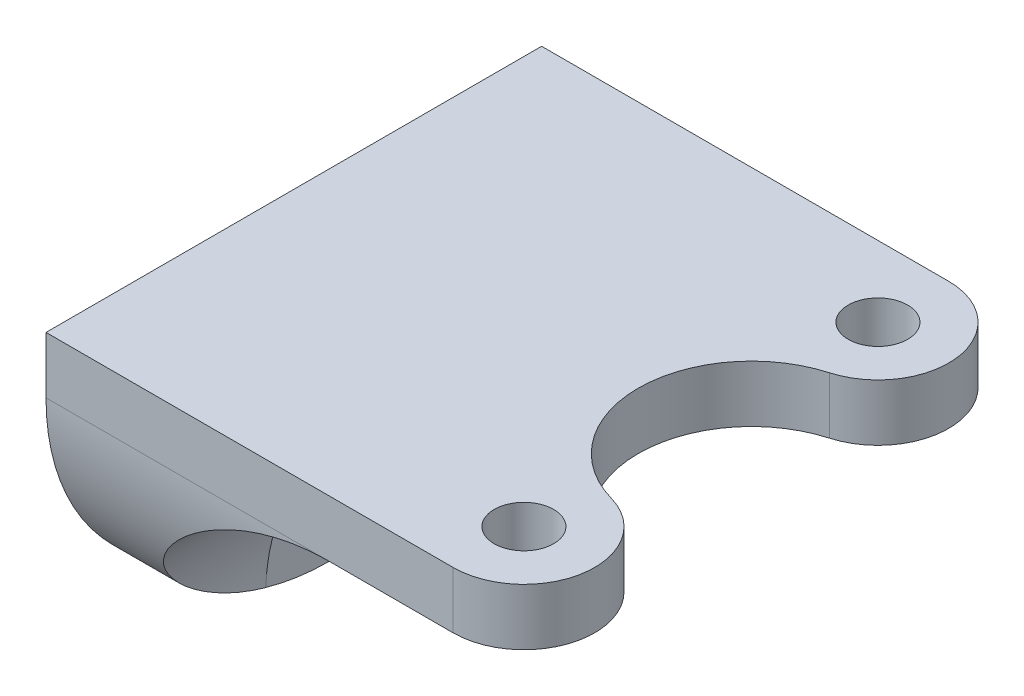
ISO-10303-21;
HEADER;
FILE_DESCRIPTION(('STEP AP214'),'2;1');
FILE_NAME('part.step','',(''),(''),'','','');
FILE_SCHEMA(('AUTOMOTIVE_DESIGN { 1 0 10303 214 1 1 1 1 }'));
ENDSEC;
DATA;
#1=APPLICATION_CONTEXT('core data for automotive mechanical design processes');
#2=APPLICATION_PROTOCOL_DEFINITION('international standard','automotive_design',2000,#1);
#3=PRODUCT_CONTEXT('',#1,'mechanical');
#4=PRODUCT('Part','Part','',(#3));
#5=PRODUCT_RELATED_PRODUCT_CATEGORY('part','',(#4));
#6=PRODUCT_DEFINITION_FORMATION('','',#4);
#7=PRODUCT_DEFINITION_CONTEXT('part definition',#1,'design');
#8=PRODUCT_DEFINITION('design','',#6,#7);
#9=PRODUCT_DEFINITION_SHAPE('','',#8);
#10=(LENGTH_UNIT() NAMED_UNIT(*) SI_UNIT(.MILLI.,.METRE.));
#11=(NAMED_UNIT(*) PLANE_ANGLE_UNIT() SI_UNIT($,.RADIAN.));
#12=(NAMED_UNIT(*) SI_UNIT($,.STERADIAN.) SOLID_ANGLE_UNIT());
#13=UNCERTAINTY_MEASURE_WITH_UNIT(LENGTH_MEASURE(1.E-05),#10,'distance_accuracy_value','');
#14=(GEOMETRIC_REPRESENTATION_CONTEXT(3) GLOBAL_UNCERTAINTY_ASSIGNED_CONTEXT((#13)) GLOBAL_UNIT_ASSIGNED_CONTEXT((#10,
#11,#12)) REPRESENTATION_CONTEXT('',''));
#15=CARTESIAN_POINT('',(0.,0.,0.));
#16=DIRECTION('',(0.,0.,1.));
#17=DIRECTION('',(1.,0.,0.));
#18=AXIS2_PLACEMENT_3D('',#15,#16,#17);
#19=CARTESIAN_POINT('',(4.,-10.,0.));
#20=DIRECTION('',(-1.,0.,0.));
#21=DIRECTION('',(0.,0.,1.));
#22=AXIS2_PLACEMENT_3D('',#19,#20,#21);
#23=CYLINDRICAL_SURFACE('',#22,2.6);
#24=CARTESIAN_POINT('',(0.,-10.,0.));
#25=DIRECTION('',(1.,0.,0.));
#26=DIRECTION('',(0.,0.,-1.));
#27=AXIS2_PLACEMENT_3D('',#24,#25,#26);
#28=CIRCLE('',#27,2.6);
#29=CARTESIAN_POINT('',(0.,-10.,-2.6));
#30=VERTEX_POINT('',#29);
#31=EDGE_CURVE('E344',#30,#30,#28,.T.);
#32=ORIENTED_EDGE('',*,*,#31,.F.);
#33=EDGE_LOOP('',(#32));
#34=FACE_BOUND('',#33,.T.);
#35=CARTESIAN_POINT('',(4.,-10.,0.));
#36=DIRECTION('',(1.,0.,0.));
#37=DIRECTION('',(0.,0.,-1.));
#38=AXIS2_PLACEMENT_3D('',#35,#36,#37);
#39=CIRCLE('',#38,2.6);
#40=CARTESIAN_POINT('',(4.,-10.,-2.6));
#41=VERTEX_POINT('',#40);
#42=EDGE_CURVE('E347',#41,#41,#39,.T.);
#43=ORIENTED_EDGE('',*,*,#42,.T.);
#44=EDGE_LOOP('',(#43));
#45=FACE_BOUND('',#44,.T.);
#46=ADVANCED_FACE('F43',(#34,#45),#23,.F.);
#47=CARTESIAN_POINT('',(4.,-4.,1.50000000000004));
#48=DIRECTION('',(-1.,0.,0.));
#49=DIRECTION('',(0.,0.,1.));
#50=AXIS2_PLACEMENT_3D('',#47,#48,#49);
#51=CYLINDRICAL_SURFACE('',#50,16.);
#52=CARTESIAN_POINT('',(4.,-4.,1.50000000000004));
#53=DIRECTION('',(1.,0.,0.));
#54=DIRECTION('',(0.,0.,-1.));
#55=AXIS2_PLACEMENT_3D('',#52,#53,#54);
#56=CIRCLE('',#55,16.);
#57=CARTESIAN_POINT('',(4.,-19.3541525327841,6.));
#58=VERTEX_POINT('',#57);
#59=CARTESIAN_POINT('',(4.,-20.,1.50000000000004));
#60=VERTEX_POINT('',#59);
#61=EDGE_CURVE('E357',#58,#60,#56,.T.);
#62=ORIENTED_EDGE('',*,*,#61,.F.);
#63=DIRECTION('',(-1.,0.,0.));
#64=VECTOR('',#63,1.);
#65=CARTESIAN_POINT('',(33.75,-19.3541525327841,6.));
#66=LINE('',#65,#64);
#67=CARTESIAN_POINT('',(4.01304028124513,-19.3541525327841,6.));
#68=VERTEX_POINT('',#67);
#69=EDGE_CURVE('E351',#68,#58,#66,.T.);
#70=ORIENTED_EDGE('',*,*,#69,.F.);
#71=CARTESIAN_POINT('',(4.,-20.,1.50000000000004));
#72=CARTESIAN_POINT('',(4.00000851923164,-20.0000024487613,1.72270361274778));
#73=CARTESIAN_POINT('',(4.00000021424389,-19.9953502392111,1.9454045044037));
#74=CARTESIAN_POINT('',(4.00001194280186,-19.9767562481734,2.39041238437752));
#75=CARTESIAN_POINT('',(4.00003197561349,-19.9628147073318,2.61271938274988));
#76=CARTESIAN_POINT('',(4.00016236043493,-19.9256618893986,3.05656148291711));
#77=CARTESIAN_POINT('',(4.00027271199306,-19.9024506586658,3.2780965885667));
#78=CARTESIAN_POINT('',(4.00070968081685,-19.846806097991,3.71998987887598));
#79=CARTESIAN_POINT('',(4.00103630326584,-19.8143725470303,3.94034803520037));
#80=CARTESIAN_POINT('',(4.00257694290808,-19.7031712105544,4.59988653567085));
#81=CARTESIAN_POINT('',(4.00435244505339,-19.6105596925057,5.03685060527537));
#82=CARTESIAN_POINT('',(4.0095502747178,-19.4445639173252,5.68512531663313));
#83=CARTESIAN_POINT('',(4.01170542947892,-19.3847164334122,5.90002878390668));
#84=CARTESIAN_POINT('',(4.01717387958267,-19.2560772646724,6.32720056997185));
#85=CARTESIAN_POINT('',(4.02048750281575,-19.187283051048,6.53946812506807));
#86=CARTESIAN_POINT('',(4.03266877706484,-18.9675437637232,7.17203428782388));
#87=CARTESIAN_POINT('',(4.04377516462871,-18.8033279599834,7.58776099275339));
#88=CARTESIAN_POINT('',(4.07511195087486,-18.4408343617475,8.40373507604534));
#89=CARTESIAN_POINT('',(4.09534177940887,-18.2425586962228,8.80398341999528));
#90=CARTESIAN_POINT('',(4.13527809373697,-17.9210051656234,9.39020316040592));
#91=CARTESIAN_POINT('',(4.15018520829917,-17.8098197486931,9.58321710139696));
#92=CARTESIAN_POINT('',(4.18369331308156,-17.5796758863064,9.96415516302514));
#93=CARTESIAN_POINT('',(4.20229338131313,-17.4607193859549,10.1520805408));
#94=CARTESIAN_POINT('',(4.26440958285752,-17.0925676715534,10.7077096266688));
#95=CARTESIAN_POINT('',(4.31424638765456,-16.8320492629194,11.0673409173672));
#96=CARTESIAN_POINT('',(4.43262988497217,-16.2946415255452,11.7480495666715));
#97=CARTESIAN_POINT('',(4.50037321714628,-16.0187834590487,12.0700825374318));
#98=CARTESIAN_POINT('',(4.65904244851858,-15.4455057952533,12.6882981420798));
#99=CARTESIAN_POINT('',(4.74996781671542,-15.1480866919373,12.9844813678661));
#100=CARTESIAN_POINT('',(4.95826521088042,-14.5364465732705,13.5480709233121));
#101=CARTESIAN_POINT('',(5.0756035273918,-14.2222473599629,13.8155132962289));
#102=CARTESIAN_POINT('',(5.33955662425,-13.5819643810614,14.3199834634258));
#103=CARTESIAN_POINT('',(5.48616630930786,-13.2558826919235,14.5570165392962));
#104=CARTESIAN_POINT('',(5.78837737013365,-12.6426762200264,14.9692811552128));
#105=CARTESIAN_POINT('',(5.94003172342225,-12.3562971974617,15.1485328443778));
#106=CARTESIAN_POINT('',(6.26707211279426,-11.7832197442357,15.4832603095025));
#107=CARTESIAN_POINT('',(6.44245573599521,-11.4965213489854,15.6387384994226));
#108=CARTESIAN_POINT('',(6.81687362104425,-10.9268881521257,15.926367108075));
#109=CARTESIAN_POINT('',(7.01590907905849,-10.6439535416711,16.0585163461298));
#110=CARTESIAN_POINT('',(7.43695065442984,-10.0857681986316,16.3005399130856));
#111=CARTESIAN_POINT('',(7.6589569063587,-9.81051751107409,16.4104141114798));
#112=CARTESIAN_POINT('',(8.1112387891084,-9.28692268613451,16.6037008131398));
#113=CARTESIAN_POINT('',(8.34028614180422,-9.0379441822864,16.6882792131575));
#114=CARTESIAN_POINT('',(8.81646819261513,-8.55254606265358,16.8407642842143));
#115=CARTESIAN_POINT('',(9.06360193380138,-8.31612578356907,16.9086718364611));
#116=CARTESIAN_POINT('',(9.57458362147785,-7.85798737805656,17.0297165188983));
#117=CARTESIAN_POINT('',(9.83843384857897,-7.63627126618314,17.0828516283501));
#118=CARTESIAN_POINT('',(10.3813246392124,-7.20936438640821,17.176343379132));
#119=CARTESIAN_POINT('',(10.6603662141349,-7.00417472104391,17.2166991684346));
#120=CARTESIAN_POINT('',(11.2603762355159,-6.59238576765731,17.2901080703964));
#121=CARTESIAN_POINT('',(11.582762483476,-6.38765230366328,17.3220449095643));
#122=CARTESIAN_POINT('',(12.2419982906519,-6.00145064481405,17.3755224310796));
#123=CARTESIAN_POINT('',(12.5788486744946,-5.81998377878736,17.3970625198301));
#124=CARTESIAN_POINT('',(13.2652605836889,-5.48139678788382,17.4321832516842));
#125=CARTESIAN_POINT('',(13.6148310311639,-5.32429417549506,17.4457581889414));
#126=CARTESIAN_POINT('',(14.3245018780267,-5.03552516837703,17.4671115140508));
#127=CARTESIAN_POINT('',(14.6846029197257,-4.90386032896,17.4748895475527));
#128=CARTESIAN_POINT('',(15.4479150859424,-4.65547426393639,17.4870973854324));
#129=CARTESIAN_POINT('',(15.8519795616763,-4.54134859138193,17.4911404054734));
#130=CARTESIAN_POINT('',(16.6678557207168,-4.34519554453929,17.4965766049018));
#131=CARTESIAN_POINT('',(17.0796680905089,-4.26317102867626,17.4979695483577));
#132=CARTESIAN_POINT('',(17.9083208380082,-4.13177011812965,17.4995931941799));
#133=CARTESIAN_POINT('',(18.3251587490454,-4.08237832155416,17.4998244451792));
#134=CARTESIAN_POINT('',(18.9522502419788,-4.0329642997105,17.4999732199892));
#135=CARTESIAN_POINT('',(19.1615989561566,-4.02060523678991,17.4999897897611));
#136=CARTESIAN_POINT('',(19.5806243562942,-4.00412310206751,17.5000006556876));
#137=CARTESIAN_POINT('',(19.7903010484282,-4.00000018722609,17.4999949514178));
#138=CARTESIAN_POINT('',(20.,-4.,17.5));
#139=B_SPLINE_CURVE_WITH_KNOTS('',3,(#71,#72,#73,#74,#75,#76,#77,#78,#79,#80,#81,#82,#83,#84,
#85,#86,#87,#88,#89,#90,#91,#92,#93,#94,#95,#96,#97,#98,#99,#100,#101,#102,#103,#104,#105,#106,
#107,#108,#109,#110,#111,#112,#113,#114,#115,#116,#117,#118,#119,#120,#121,#122,#123,#124,#125,
#126,#127,#128,#129,#130,#131,#132,#133,#134,#135,#136,#137,#138),.UNSPECIFIED.,.F.,.F.,(4,2,2,
2,2,2,2,2,2,2,2,2,2,2,2,2,2,2,2,2,2,2,2,2,2,2,2,2,2,2,2,2,2,4),(0.,0.668056925191833,
1.33609654462806,2.00413282316792,2.67218511296876,4.01033167823864,4.67945010912922,
5.34875807940665,6.68840931740084,8.02797684859699,8.69751693400278,9.36689007069703,
10.7053814709446,11.9917977240153,13.2781845134357,14.5629387707118,15.8474695845315,
16.9569769529285,18.0663715870649,19.175822351541,20.2852796159748,21.3303288629903,
22.3753228576373,23.4204597278973,24.46566626525,25.61419656265,26.7627924270309,
27.9122100881612,29.0616980045768,30.3200312053663,31.5784764280793,32.8363272685189,
33.4653271530252,34.0943390245824),.UNSPECIFIED.);
#140=CARTESIAN_POINT('',(20.,-4.,17.5));
#141=VERTEX_POINT('',#140);
#142=EDGE_CURVE('E59',#68,#141,#139,.T.);
#143=ORIENTED_EDGE('',*,*,#142,.T.);
#144=DIRECTION('',(-1.,0.,0.));
#145=VECTOR('',#144,1.);
#146=CARTESIAN_POINT('',(4.,-4.,17.5));
#147=LINE('',#146,#145);
#148=CARTESIAN_POINT('',(0.,-4.,17.5));
#149=VERTEX_POINT('',#148);
#150=EDGE_CURVE('E311',#141,#149,#147,.T.);
#151=ORIENTED_EDGE('',*,*,#150,.T.);
#152=CARTESIAN_POINT('',(0.,-4.,1.50000000000004));
#153=DIRECTION('',(1.,0.,0.));
#154=DIRECTION('',(0.,0.,-1.));
#155=AXIS2_PLACEMENT_3D('',#152,#153,#154);
#156=CIRCLE('',#155,16.);
#157=CARTESIAN_POINT('',(0.,-20.,1.50000000000004));
#158=VERTEX_POINT('',#157);
#159=EDGE_CURVE('E342',#158,#149,#156,.F.);
#160=ORIENTED_EDGE('',*,*,#159,.F.);
#161=DIRECTION('',(-1.,0.,0.));
#162=VECTOR('',#161,1.);
#163=CARTESIAN_POINT('',(4.,-20.,1.50000000000004));
#164=LINE('',#163,#162);
#165=EDGE_CURVE('E316',#60,#158,#164,.T.);
#166=ORIENTED_EDGE('',*,*,#165,.F.);
#167=EDGE_LOOP('',(#62,#70,#143,#151,#160,#166));
#168=FACE_BOUND('',#167,.T.);
#169=ADVANCED_FACE('F267',(#168),#51,.T.);
#170=CARTESIAN_POINT('',(20.,-20.,0.));
#171=DIRECTION('',(0.,0.,-1.));
#172=DIRECTION('',(-1.,0.,0.));
#173=AXIS2_PLACEMENT_3D('',#170,#171,#172);
#174=CYLINDRICAL_SURFACE('',#173,16.);
#175=CARTESIAN_POINT('',(20.,-20.,6.));
#176=DIRECTION('',(0.,0.,-1.));
#177=DIRECTION('',(-1.,0.,0.));
#178=AXIS2_PLACEMENT_3D('',#175,#176,#177);
#179=CIRCLE('',#178,16.);
#180=CARTESIAN_POINT('',(7.5100040032032,-10.,6.));
#181=VERTEX_POINT('',#180);
#182=EDGE_CURVE('E11',#181,#68,#179,.F.);
#183=ORIENTED_EDGE('',*,*,#182,.F.);
#184=CARTESIAN_POINT('',(7.5100040032032,-10.,6.));
#185=CARTESIAN_POINT('',(7.66987962993509,-9.80025486884565,5.99997708136039));
#186=CARTESIAN_POINT('',(7.83449382011226,-9.60452819843315,5.99003047807788));
#187=CARTESIAN_POINT('',(8.17174754603307,-9.22238634379673,5.95249314425945));
#188=CARTESIAN_POINT('',(8.34437425439018,-9.03595720453377,5.92492977072562));
#189=CARTESIAN_POINT('',(8.69518041322576,-8.67462932201716,5.85465377636596));
#190=CARTESIAN_POINT('',(8.87329892963013,-8.49964480307019,5.8120742341719));
#191=CARTESIAN_POINT('',(9.23558940620011,-8.15984898724368,5.7135935678457));
#192=CARTESIAN_POINT('',(9.41976463521369,-7.99504332677464,5.65768514482863));
#193=CARTESIAN_POINT('',(9.88699765596843,-7.595837835482,5.5032762915072));
#194=CARTESIAN_POINT('',(10.1732938065401,-7.36801981283911,5.39748189911597));
#195=CARTESIAN_POINT('',(10.7550312748524,-6.93623704021922,5.16464430830273));
#196=CARTESIAN_POINT('',(11.0504754189614,-6.73227975717043,5.03759448831788));
#197=CARTESIAN_POINT('',(11.6503081822889,-6.34677828331189,4.76549503013442));
#198=CARTESIAN_POINT('',(11.9547383449687,-6.16536917999872,4.6203464484761));
#199=CARTESIAN_POINT('',(12.5693602837925,-5.82576656690083,4.31598911905124));
#200=CARTESIAN_POINT('',(12.8795520609833,-5.6675730613348,4.15678036872973));
#201=CARTESIAN_POINT('',(13.635080483674,-5.31233609410906,3.75817328122698));
#202=CARTESIAN_POINT('',(14.0827633881786,-5.12665318382781,3.51305043128148));
#203=CARTESIAN_POINT('',(14.9847965613971,-4.79874366551841,3.00633384874722));
#204=CARTESIAN_POINT('',(15.439150079497,-4.65653902596385,2.74473186991286));
#205=CARTESIAN_POINT('',(16.35131520542,-4.41445289404303,2.21074820934405));
#206=CARTESIAN_POINT('',(16.8091173297239,-4.3144814624679,1.93839079960171));
#207=CARTESIAN_POINT('',(17.7272659664139,-4.15539179166013,1.38669224675655));
#208=CARTESIAN_POINT('',(18.1876109124071,-4.09625073306425,1.10735509511227));
#209=CARTESIAN_POINT('',(18.8700367215397,-4.03840264194458,0.691331574567839));
#210=CARTESIAN_POINT('',(19.091690405758,-4.02426099979628,0.555905636727091));
#211=CARTESIAN_POINT('',(19.5350445448379,-4.00521909319188,0.28472101299861));
#212=CARTESIAN_POINT('',(19.7567448971153,-4.00031344644078,0.148962567099714));
#213=CARTESIAN_POINT('',(19.9856170900409,-4.0000048488929,0.00880769748044533));
#214=CARTESIAN_POINT('',(19.9928085571949,-4.00000000047071,0.00440384118726945));
#215=CARTESIAN_POINT('',(20.,-4.,0.));
#216=B_SPLINE_CURVE_WITH_KNOTS('',3,(#184,#185,#186,#187,#188,#189,#190,#191,#192,#193,#194,
#195,#196,#197,#198,#199,#200,#201,#202,#203,#204,#205,#206,#207,#208,#209,#210,#211,#212,#213,
#214,#215),.UNSPECIFIED.,.F.,.F.,(4,2,2,2,2,2,2,2,2,2,2,2,2,2,2,4),(0.,0.767024024672259,
1.5328598257132,2.2920723585008,3.05170159430657,4.19255688952106,5.33376825189502,
6.48151709401005,7.62926614469184,9.25627785756357,10.8841103049826,12.5084584528681,
14.1318980452035,14.9121815773702,15.6920102568159,15.7173084822789),.UNSPECIFIED.);
#217=CARTESIAN_POINT('',(20.,-4.,0.));
#218=VERTEX_POINT('',#217);
#219=EDGE_CURVE('E52',#218,#181,#216,.F.);
#220=ORIENTED_EDGE('',*,*,#219,.F.);
#221=DIRECTION('',(0.,0.,-1.));
#222=VECTOR('',#221,1.);
#223=CARTESIAN_POINT('',(20.,-4.,0.));
#224=LINE('',#223,#222);
#225=EDGE_CURVE('E265',#141,#218,#224,.T.);
#226=ORIENTED_EDGE('',*,*,#225,.F.);
#227=ORIENTED_EDGE('',*,*,#142,.F.);
#228=EDGE_LOOP('',(#183,#220,#226,#227));
#229=FACE_BOUND('',#228,.T.);
#230=ADVANCED_FACE('F45',(#229),#174,.F.);
#231=CARTESIAN_POINT('',(28.75,-4.,12.5));
#232=DIRECTION('',(0.,1.,0.));
#233=DIRECTION('',(0.,0.,1.));
#234=AXIS2_PLACEMENT_3D('',#231,#232,#233);
#235=CYLINDRICAL_SURFACE('',#234,5.);
#236=CARTESIAN_POINT('',(28.75,0.,12.5));
#237=DIRECTION('',(0.,1.,0.));
#238=DIRECTION('',(0.,0.,1.));
#239=AXIS2_PLACEMENT_3D('',#236,#237,#238);
#240=CIRCLE('',#239,5.);
#241=CARTESIAN_POINT('',(30.1233516208735,0.,7.69230769230771));
#242=VERTEX_POINT('',#241);
#243=CARTESIAN_POINT('',(28.75,0.,17.5));
#244=VERTEX_POINT('',#243);
#245=EDGE_CURVE('E310',#242,#244,#240,.F.);
#246=ORIENTED_EDGE('',*,*,#245,.T.);
#247=DIRECTION('',(0.,1.,0.));
#248=VECTOR('',#247,1.);
#249=CARTESIAN_POINT('',(28.75,-4.,17.5));
#250=LINE('',#249,#248);
#251=CARTESIAN_POINT('',(28.75,-4.,17.5));
#252=VERTEX_POINT('',#251);
#253=EDGE_CURVE('E325',#252,#244,#250,.T.);
#254=ORIENTED_EDGE('',*,*,#253,.F.);
#255=CARTESIAN_POINT('',(28.75,-4.,12.5));
#256=DIRECTION('',(0.,1.,0.));
#257=DIRECTION('',(0.,0.,1.));
#258=AXIS2_PLACEMENT_3D('',#255,#256,#257);
#259=CIRCLE('',#258,5.);
#260=CARTESIAN_POINT('',(30.1233516208735,-4.,7.69230769230771));
#261=VERTEX_POINT('',#260);
#262=EDGE_CURVE('E334',#261,#252,#259,.F.);
#263=ORIENTED_EDGE('',*,*,#262,.F.);
#264=DIRECTION('',(0.,1.,0.));
#265=VECTOR('',#264,1.);
#266=CARTESIAN_POINT('',(30.1233516208735,-4.,7.69230769230771));
#267=LINE('',#266,#265);
#268=EDGE_CURVE('E329',#261,#242,#267,.T.);
#269=ORIENTED_EDGE('',*,*,#268,.T.);
#270=EDGE_LOOP('',(#246,#254,#263,#269));
#271=FACE_BOUND('',#270,.T.);
#272=ADVANCED_FACE('F287',(#271),#235,.T.);
#273=CARTESIAN_POINT('',(0.,-4.,17.5));
#274=DIRECTION('',(0.,0.,-1.));
#275=DIRECTION('',(-1.,0.,0.));
#276=AXIS2_PLACEMENT_3D('',#273,#274,#275);
#277=PLANE('',#276);
#278=DIRECTION('',(-1.,0.,0.));
#279=VECTOR('',#278,1.);
#280=CARTESIAN_POINT('',(0.,0.,17.5));
#281=LINE('',#280,#279);
#282=CARTESIAN_POINT('',(0.,0.,17.5));
#283=VERTEX_POINT('',#282);
#284=EDGE_CURVE('E85',#244,#283,#281,.T.);
#285=ORIENTED_EDGE('',*,*,#284,.T.);
#286=DIRECTION('',(0.,1.,0.));
#287=VECTOR('',#286,1.);
#288=CARTESIAN_POINT('',(0.,-4.,17.5));
#289=LINE('',#288,#287);
#290=EDGE_CURVE('E327',#149,#283,#289,.T.);
#291=ORIENTED_EDGE('',*,*,#290,.F.);
#292=ORIENTED_EDGE('',*,*,#150,.F.);
#293=DIRECTION('',(-1.,0.,0.));
#294=VECTOR('',#293,1.);
#295=CARTESIAN_POINT('',(0.,-4.,17.5));
#296=LINE('',#295,#294);
#297=EDGE_CURVE('E67',#252,#141,#296,.T.);
#298=ORIENTED_EDGE('',*,*,#297,.F.);
#299=ORIENTED_EDGE('',*,*,#253,.T.);
#300=EDGE_LOOP('',(#285,#291,#292,#298,#299));
#301=FACE_BOUND('',#300,.T.);
#302=ADVANCED_FACE('F283',(#301),#277,.F.);
#303=CARTESIAN_POINT('',(0.,-4.,0.));
#304=DIRECTION('',(-1.,0.,0.));
#305=DIRECTION('',(0.,0.,1.));
#306=AXIS2_PLACEMENT_3D('',#303,#304,#305);
#307=PLANE('',#306);
#308=DIRECTION('',(0.,0.,1.));
#309=VECTOR('',#308,1.);
#310=CARTESIAN_POINT('',(0.,0.,0.));
#311=LINE('',#310,#309);
#312=CARTESIAN_POINT('',(0.,0.,-17.5));
#313=VERTEX_POINT('',#312);
#314=EDGE_CURVE('E322',#313,#283,#311,.T.);
#315=ORIENTED_EDGE('',*,*,#314,.F.);
#316=DIRECTION('',(0.,1.,0.));
#317=VECTOR('',#316,1.);
#318=CARTESIAN_POINT('',(0.,-4.,-17.5));
#319=LINE('',#318,#317);
#320=CARTESIAN_POINT('',(0.,-4.,-17.5));
#321=VERTEX_POINT('',#320);
#322=EDGE_CURVE('E211',#321,#313,#319,.T.);
#323=ORIENTED_EDGE('',*,*,#322,.F.);
#324=CARTESIAN_POINT('',(0.,-4.,-1.50000000000004));
#325=DIRECTION('',(-1.,0.,0.));
#326=DIRECTION('',(0.,0.,1.));
#327=AXIS2_PLACEMENT_3D('',#324,#325,#326);
#328=CIRCLE('',#327,16.);
#329=CARTESIAN_POINT('',(0.,-20.,-1.50000000000004));
#330=VERTEX_POINT('',#329);
#331=EDGE_CURVE('E172',#330,#321,#328,.F.);
#332=ORIENTED_EDGE('',*,*,#331,.F.);
#333=DIRECTION('',(0.,0.,1.));
#334=VECTOR('',#333,1.);
#335=CARTESIAN_POINT('',(0.,-20.,0.));
#336=LINE('',#335,#334);
#337=EDGE_CURVE('E339',#330,#158,#336,.T.);
#338=ORIENTED_EDGE('',*,*,#337,.T.);
#339=ORIENTED_EDGE('',*,*,#159,.T.);
#340=ORIENTED_EDGE('',*,*,#290,.T.);
#341=EDGE_LOOP('',(#315,#323,#332,#338,#339,#340));
#342=FACE_BOUND('',#341,.T.);
#343=ORIENTED_EDGE('',*,*,#31,.T.);
#344=EDGE_LOOP('',(#343));
#345=FACE_BOUND('',#344,.T.);
#346=ADVANCED_FACE('F286',(#342,#345),#307,.T.);
#347=CARTESIAN_POINT('',(28.75,-4.,12.5));
#348=DIRECTION('',(0.,1.,0.));
#349=DIRECTION('',(0.,0.,1.));
#350=AXIS2_PLACEMENT_3D('',#347,#348,#349);
#351=CYLINDRICAL_SURFACE('',#350,2.1);
#352=CARTESIAN_POINT('',(28.75,-4.,12.5));
#353=DIRECTION('',(0.,1.,0.));
#354=DIRECTION('',(0.,0.,1.));
#355=AXIS2_PLACEMENT_3D('',#352,#353,#354);
#356=CIRCLE('',#355,2.1);
#357=CARTESIAN_POINT('',(28.75,-4.,14.6));
#358=VERTEX_POINT('',#357);
#359=EDGE_CURVE('E305',#358,#358,#356,.T.);
#360=ORIENTED_EDGE('',*,*,#359,.F.);
#361=EDGE_LOOP('',(#360));
#362=FACE_BOUND('',#361,.T.);
#363=CARTESIAN_POINT('',(28.75,0.,12.5));
#364=DIRECTION('',(0.,1.,0.));
#365=DIRECTION('',(0.,0.,1.));
#366=AXIS2_PLACEMENT_3D('',#363,#364,#365);
#367=CIRCLE('',#366,2.1);
#368=CARTESIAN_POINT('',(28.75,0.,14.6));
#369=VERTEX_POINT('',#368);
#370=EDGE_CURVE('E308',#369,#369,#367,.T.);
#371=ORIENTED_EDGE('',*,*,#370,.T.);
#372=EDGE_LOOP('',(#371));
#373=FACE_BOUND('',#372,.T.);
#374=ADVANCED_FACE('F290',(#362,#373),#351,.F.);
#375=CARTESIAN_POINT('',(32.3207142142713,-4.,0.));
#376=DIRECTION('',(0.,1.,0.));
#377=DIRECTION('',(0.,0.,1.));
#378=AXIS2_PLACEMENT_3D('',#375,#376,#377);
#379=CYLINDRICAL_SURFACE('',#378,8.);
#380=CARTESIAN_POINT('',(32.3207142142713,0.,0.));
#381=DIRECTION('',(0.,1.,0.));
#382=DIRECTION('',(0.,0.,1.));
#383=AXIS2_PLACEMENT_3D('',#380,#381,#382);
#384=CIRCLE('',#383,8.);
#385=CARTESIAN_POINT('',(30.1233516208735,0.,-7.69230769230771));
#386=VERTEX_POINT('',#385);
#387=EDGE_CURVE('E314',#386,#242,#384,.T.);
#388=ORIENTED_EDGE('',*,*,#387,.T.);
#389=ORIENTED_EDGE('',*,*,#268,.F.);
#390=CARTESIAN_POINT('',(32.3207142142713,-4.,0.));
#391=DIRECTION('',(0.,1.,0.));
#392=DIRECTION('',(0.,0.,1.));
#393=AXIS2_PLACEMENT_3D('',#390,#391,#392);
#394=CIRCLE('',#393,8.);
#395=CARTESIAN_POINT('',(30.1233516208735,-4.,-7.69230769230771));
#396=VERTEX_POINT('',#395);
#397=EDGE_CURVE('E90',#396,#261,#394,.T.);
#398=ORIENTED_EDGE('',*,*,#397,.F.);
#399=DIRECTION('',(0.,1.,0.));
#400=VECTOR('',#399,1.);
#401=CARTESIAN_POINT('',(30.1233516208735,-4.,-7.69230769230771));
#402=LINE('',#401,#400);
#403=EDGE_CURVE('E199',#396,#386,#402,.T.);
#404=ORIENTED_EDGE('',*,*,#403,.T.);
#405=EDGE_LOOP('',(#388,#389,#398,#404));
#406=FACE_BOUND('',#405,.T.);
#407=ADVANCED_FACE('F279',(#406),#379,.F.);
#408=CARTESIAN_POINT('',(0.,-4.,0.));
#409=DIRECTION('',(0.,1.,0.));
#410=DIRECTION('',(0.,0.,1.));
#411=AXIS2_PLACEMENT_3D('',#408,#409,#410);
#412=PLANE('',#411);
#413=ORIENTED_EDGE('',*,*,#359,.T.);
#414=EDGE_LOOP('',(#413));
#415=FACE_BOUND('',#414,.T.);
#416=ORIENTED_EDGE('',*,*,#297,.T.);
#417=ORIENTED_EDGE('',*,*,#225,.T.);
#418=DIRECTION('',(0.,0.,1.));
#419=VECTOR('',#418,1.);
#420=CARTESIAN_POINT('',(20.,-4.,0.));
#421=LINE('',#420,#419);
#422=CARTESIAN_POINT('',(20.,-4.,-17.5));
#423=VERTEX_POINT('',#422);
#424=EDGE_CURVE('E210',#423,#218,#421,.T.);
#425=ORIENTED_EDGE('',*,*,#424,.F.);
#426=DIRECTION('',(-1.,0.,0.));
#427=VECTOR('',#426,1.);
#428=CARTESIAN_POINT('',(0.,-4.,-17.5));
#429=LINE('',#428,#427);
#430=CARTESIAN_POINT('',(28.75,-4.,-17.5));
#431=VERTEX_POINT('',#430);
#432=EDGE_CURVE('E197',#431,#423,#429,.T.);
#433=ORIENTED_EDGE('',*,*,#432,.F.);
#434=CARTESIAN_POINT('',(28.75,-4.,-12.5));
#435=DIRECTION('',(0.,-1.,0.));
#436=DIRECTION('',(0.,0.,-1.));
#437=AXIS2_PLACEMENT_3D('',#434,#435,#436);
#438=CIRCLE('',#437,5.);
#439=EDGE_CURVE('E193',#396,#431,#438,.F.);
#440=ORIENTED_EDGE('',*,*,#439,.F.);
#441=ORIENTED_EDGE('',*,*,#397,.T.);
#442=ORIENTED_EDGE('',*,*,#262,.T.);
#443=EDGE_LOOP('',(#416,#417,#425,#433,#440,#441,#442));
#444=FACE_BOUND('',#443,.T.);
#445=CARTESIAN_POINT('',(28.75,-4.,-12.5));
#446=DIRECTION('',(0.,-1.,0.));
#447=DIRECTION('',(0.,0.,-1.));
#448=AXIS2_PLACEMENT_3D('',#445,#446,#447);
#449=CIRCLE('',#448,2.1);
#450=CARTESIAN_POINT('',(28.75,-4.,-14.6));
#451=VERTEX_POINT('',#450);
#452=EDGE_CURVE('E190',#451,#451,#449,.T.);
#453=ORIENTED_EDGE('',*,*,#452,.F.);
#454=EDGE_LOOP('',(#453));
#455=FACE_BOUND('',#454,.T.);
#456=ADVANCED_FACE('F275',(#415,#444,#455),#412,.F.);
#457=CARTESIAN_POINT('',(0.,0.,0.));
#458=DIRECTION('',(0.,1.,0.));
#459=DIRECTION('',(0.,0.,1.));
#460=AXIS2_PLACEMENT_3D('',#457,#458,#459);
#461=PLANE('',#460);
#462=ORIENTED_EDGE('',*,*,#387,.F.);
#463=CARTESIAN_POINT('',(28.75,0.,-12.5));
#464=DIRECTION('',(0.,-1.,0.));
#465=DIRECTION('',(0.,0.,-1.));
#466=AXIS2_PLACEMENT_3D('',#463,#464,#465);
#467=CIRCLE('',#466,5.);
#468=CARTESIAN_POINT('',(28.75,0.,-17.5));
#469=VERTEX_POINT('',#468);
#470=EDGE_CURVE('E202',#386,#469,#467,.F.);
#471=ORIENTED_EDGE('',*,*,#470,.T.);
#472=DIRECTION('',(-1.,0.,0.));
#473=VECTOR('',#472,1.);
#474=CARTESIAN_POINT('',(0.,0.,-17.5));
#475=LINE('',#474,#473);
#476=EDGE_CURVE('E194',#469,#313,#475,.T.);
#477=ORIENTED_EDGE('',*,*,#476,.T.);
#478=ORIENTED_EDGE('',*,*,#314,.T.);
#479=ORIENTED_EDGE('',*,*,#284,.F.);
#480=ORIENTED_EDGE('',*,*,#245,.F.);
#481=EDGE_LOOP('',(#462,#471,#477,#478,#479,#480));
#482=FACE_BOUND('',#481,.T.);
#483=ORIENTED_EDGE('',*,*,#370,.F.);
#484=EDGE_LOOP('',(#483));
#485=FACE_BOUND('',#484,.T.);
#486=CARTESIAN_POINT('',(28.75,0.,-12.5));
#487=DIRECTION('',(0.,-1.,0.));
#488=DIRECTION('',(0.,0.,-1.));
#489=AXIS2_PLACEMENT_3D('',#486,#487,#488);
#490=CIRCLE('',#489,2.1);
#491=CARTESIAN_POINT('',(28.75,0.,-14.6));
#492=VERTEX_POINT('',#491);
#493=EDGE_CURVE('E189',#492,#492,#490,.T.);
#494=ORIENTED_EDGE('',*,*,#493,.T.);
#495=EDGE_LOOP('',(#494));
#496=FACE_BOUND('',#495,.T.);
#497=ADVANCED_FACE('F278',(#482,#485,#496),#461,.T.);
#498=CARTESIAN_POINT('',(4.,-20.,0.));
#499=DIRECTION('',(0.,-1.,0.));
#500=DIRECTION('',(0.,0.,-1.));
#501=AXIS2_PLACEMENT_3D('',#498,#499,#500);
#502=PLANE('',#501);
#503=ORIENTED_EDGE('',*,*,#337,.F.);
#504=DIRECTION('',(-1.,0.,0.));
#505=VECTOR('',#504,1.);
#506=CARTESIAN_POINT('',(4.,-20.,-1.50000000000004));
#507=LINE('',#506,#505);
#508=CARTESIAN_POINT('',(4.,-20.,-1.50000000000004));
#509=VERTEX_POINT('',#508);
#510=EDGE_CURVE('E184',#509,#330,#507,.T.);
#511=ORIENTED_EDGE('',*,*,#510,.F.);
#512=DIRECTION('',(0.,0.,1.));
#513=VECTOR('',#512,1.);
#514=CARTESIAN_POINT('',(4.,-20.,0.));
#515=LINE('',#514,#513);
#516=EDGE_CURVE('E177',#509,#60,#515,.T.);
#517=ORIENTED_EDGE('',*,*,#516,.T.);
#518=ORIENTED_EDGE('',*,*,#165,.T.);
#519=EDGE_LOOP('',(#503,#511,#517,#518));
#520=FACE_BOUND('',#519,.T.);
#521=ADVANCED_FACE('F271',(#520),#502,.T.);
#522=CARTESIAN_POINT('',(33.75,0.,6.));
#523=DIRECTION('',(0.,0.,-1.));
#524=DIRECTION('',(-1.,0.,0.));
#525=AXIS2_PLACEMENT_3D('',#522,#523,#524);
#526=PLANE('',#525);
#527=ORIENTED_EDGE('',*,*,#182,.T.);
#528=ORIENTED_EDGE('',*,*,#69,.T.);
#529=DIRECTION('',(0.,-1.,0.));
#530=VECTOR('',#529,1.);
#531=CARTESIAN_POINT('',(4.,0.,6.));
#532=LINE('',#531,#530);
#533=CARTESIAN_POINT('',(4.,-10.,6.));
#534=VERTEX_POINT('',#533);
#535=EDGE_CURVE('E359',#534,#58,#532,.T.);
#536=ORIENTED_EDGE('',*,*,#535,.F.);
#537=DIRECTION('',(-1.,0.,0.));
#538=VECTOR('',#537,1.);
#539=CARTESIAN_POINT('',(33.75,-10.,6.));
#540=LINE('',#539,#538);
#541=EDGE_CURVE('E353',#181,#534,#540,.T.);
#542=ORIENTED_EDGE('',*,*,#541,.F.);
#543=EDGE_LOOP('',(#527,#528,#536,#542));
#544=FACE_BOUND('',#543,.T.);
#545=ADVANCED_FACE('F251',(#544),#526,.T.);
#546=CARTESIAN_POINT('',(33.75,-10.,0.));
#547=DIRECTION('',(-1.,0.,0.));
#548=DIRECTION('',(0.,0.,1.));
#549=AXIS2_PLACEMENT_3D('',#546,#547,#548);
#550=CYLINDRICAL_SURFACE('',#549,6.);
#551=CARTESIAN_POINT('',(4.,-10.,0.));
#552=DIRECTION('',(1.,0.,0.));
#553=DIRECTION('',(0.,0.,-1.));
#554=AXIS2_PLACEMENT_3D('',#551,#552,#553);
#555=CIRCLE('',#554,6.);
#556=CARTESIAN_POINT('',(4.,-10.,-6.));
#557=VERTEX_POINT('',#556);
#558=EDGE_CURVE('E355',#557,#534,#555,.T.);
#559=ORIENTED_EDGE('',*,*,#558,.F.);
#560=DIRECTION('',(-1.,0.,0.));
#561=VECTOR('',#560,1.);
#562=CARTESIAN_POINT('',(33.75,-10.,-6.));
#563=LINE('',#562,#561);
#564=CARTESIAN_POINT('',(7.5100040032032,-10.,-6.));
#565=VERTEX_POINT('',#564);
#566=EDGE_CURVE('E159',#565,#557,#563,.T.);
#567=ORIENTED_EDGE('',*,*,#566,.F.);
#568=CARTESIAN_POINT('',(7.5100040032032,-10.,-6.));
#569=CARTESIAN_POINT('',(7.66987962993509,-9.80025486884565,-5.99997708136039));
#570=CARTESIAN_POINT('',(7.83449382011226,-9.60452819843315,-5.99003047807788));
#571=CARTESIAN_POINT('',(8.17174754603307,-9.22238634379673,-5.95249314425945));
#572=CARTESIAN_POINT('',(8.34437425439018,-9.03595720453377,-5.92492977072562));
#573=CARTESIAN_POINT('',(8.69518041322576,-8.67462932201716,-5.85465377636596));
#574=CARTESIAN_POINT('',(8.87329892963013,-8.49964480307019,-5.8120742341719));
#575=CARTESIAN_POINT('',(9.23558940620011,-8.15984898724368,-5.7135935678457));
#576=CARTESIAN_POINT('',(9.41976463521369,-7.99504332677464,-5.65768514482863));
#577=CARTESIAN_POINT('',(9.88699765596843,-7.595837835482,-5.5032762915072));
#578=CARTESIAN_POINT('',(10.1732938065401,-7.36801981283911,-5.39748189911597));
#579=CARTESIAN_POINT('',(10.7550312748524,-6.93623704021922,-5.16464430830273));
#580=CARTESIAN_POINT('',(11.0504754189614,-6.73227975717043,-5.03759448831788));
#581=CARTESIAN_POINT('',(11.6503081822889,-6.34677828331189,-4.76549503013442));
#582=CARTESIAN_POINT('',(11.9547383449687,-6.16536917999872,-4.6203464484761));
#583=CARTESIAN_POINT('',(12.5693602837925,-5.82576656690083,-4.31598911905124));
#584=CARTESIAN_POINT('',(12.8795520609833,-5.6675730613348,-4.15678036872973));
#585=CARTESIAN_POINT('',(13.635080483674,-5.31233609410906,-3.75817328122698));
#586=CARTESIAN_POINT('',(14.0827633881786,-5.12665318382781,-3.51305043128148));
#587=CARTESIAN_POINT('',(14.9847965613971,-4.79874366551841,-3.00633384874722));
#588=CARTESIAN_POINT('',(15.439150079497,-4.65653902596385,-2.74473186991286));
#589=CARTESIAN_POINT('',(16.35131520542,-4.41445289404303,-2.21074820934405));
#590=CARTESIAN_POINT('',(16.8091173297239,-4.3144814624679,-1.93839079960171));
#591=CARTESIAN_POINT('',(17.7272659664139,-4.15539179166013,-1.38669224675655));
#592=CARTESIAN_POINT('',(18.1876109124071,-4.09625073306425,-1.10735509511227));
#593=CARTESIAN_POINT('',(18.8700367215397,-4.03840264194458,-0.691331574567839));
#594=CARTESIAN_POINT('',(19.091690405758,-4.02426099979628,-0.555905636727091));
#595=CARTESIAN_POINT('',(19.5350445448379,-4.00521909319188,-0.28472101299861));
#596=CARTESIAN_POINT('',(19.7567448971153,-4.00031344644078,-0.148962567099714));
#597=CARTESIAN_POINT('',(19.9856170900409,-4.0000048488929,-0.00880769748044533));
#598=CARTESIAN_POINT('',(19.9928085571949,-4.00000000047071,-0.00440384118726945));
#599=CARTESIAN_POINT('',(20.,-4.,0.));
#600=B_SPLINE_CURVE_WITH_KNOTS('',3,(#568,#569,#570,#571,#572,#573,#574,#575,#576,#577,#578,
#579,#580,#581,#582,#583,#584,#585,#586,#587,#588,#589,#590,#591,#592,#593,#594,#595,#596,#597,
#598,#599),.UNSPECIFIED.,.F.,.F.,(4,2,2,2,2,2,2,2,2,2,2,2,2,2,2,4),(0.,0.767024024672259,
1.5328598257132,2.2920723585008,3.05170159430657,4.19255688952106,5.33376825189502,
6.48151709401005,7.62926614469184,9.25627785756357,10.8841103049826,12.5084584528681,
14.1318980452035,14.9121815773702,15.6920102568159,15.7173084822789),.UNSPECIFIED.);
#601=EDGE_CURVE('E225',#218,#565,#600,.F.);
#602=ORIENTED_EDGE('',*,*,#601,.F.);
#603=ORIENTED_EDGE('',*,*,#219,.T.);
#604=ORIENTED_EDGE('',*,*,#541,.T.);
#605=EDGE_LOOP('',(#559,#567,#602,#603,#604));
#606=FACE_BOUND('',#605,.T.);
#607=ADVANCED_FACE('F247',(#606),#550,.F.);
#608=CARTESIAN_POINT('',(4.,0.,0.));
#609=DIRECTION('',(1.,0.,0.));
#610=DIRECTION('',(0.,0.,-1.));
#611=AXIS2_PLACEMENT_3D('',#608,#609,#610);
#612=PLANE('',#611);
#613=DIRECTION('',(0.,-1.,0.));
#614=VECTOR('',#613,1.);
#615=CARTESIAN_POINT('',(4.,0.,-6.));
#616=LINE('',#615,#614);
#617=CARTESIAN_POINT('',(4.,-19.3541525327841,-6.));
#618=VERTEX_POINT('',#617);
#619=EDGE_CURVE('E153',#557,#618,#616,.T.);
#620=ORIENTED_EDGE('',*,*,#619,.F.);
#621=ORIENTED_EDGE('',*,*,#558,.T.);
#622=ORIENTED_EDGE('',*,*,#535,.T.);
#623=ORIENTED_EDGE('',*,*,#61,.T.);
#624=ORIENTED_EDGE('',*,*,#516,.F.);
#625=CARTESIAN_POINT('',(4.,-4.,-1.50000000000004));
#626=DIRECTION('',(-1.,0.,0.));
#627=DIRECTION('',(0.,0.,1.));
#628=AXIS2_PLACEMENT_3D('',#625,#626,#627);
#629=CIRCLE('',#628,16.);
#630=EDGE_CURVE('E163',#618,#509,#629,.T.);
#631=ORIENTED_EDGE('',*,*,#630,.F.);
#632=EDGE_LOOP('',(#620,#621,#622,#623,#624,#631));
#633=FACE_BOUND('',#632,.T.);
#634=ORIENTED_EDGE('',*,*,#42,.F.);
#635=EDGE_LOOP('',(#634));
#636=FACE_BOUND('',#635,.T.);
#637=ADVANCED_FACE('F174',(#633,#636),#612,.T.);
#638=CARTESIAN_POINT('',(4.,-4.,-1.50000000000004));
#639=DIRECTION('',(-1.,0.,0.));
#640=DIRECTION('',(0.,0.,-1.));
#641=AXIS2_PLACEMENT_3D('',#638,#639,#640);
#642=CYLINDRICAL_SURFACE('',#641,16.);
#643=ORIENTED_EDGE('',*,*,#630,.T.);
#644=ORIENTED_EDGE('',*,*,#510,.T.);
#645=ORIENTED_EDGE('',*,*,#331,.T.);
#646=DIRECTION('',(-1.,0.,0.));
#647=VECTOR('',#646,1.);
#648=CARTESIAN_POINT('',(4.,-4.,-17.5));
#649=LINE('',#648,#647);
#650=EDGE_CURVE('E186',#423,#321,#649,.T.);
#651=ORIENTED_EDGE('',*,*,#650,.F.);
#652=CARTESIAN_POINT('',(4.,-20.,-1.50000000000004));
#653=CARTESIAN_POINT('',(4.00000851923164,-20.0000024487613,-1.72270361274778));
#654=CARTESIAN_POINT('',(4.00000021424389,-19.9953502392111,-1.9454045044037));
#655=CARTESIAN_POINT('',(4.00001194280186,-19.9767562481734,-2.39041238437752));
#656=CARTESIAN_POINT('',(4.00003197561349,-19.9628147073318,-2.61271938274988));
#657=CARTESIAN_POINT('',(4.00016236043493,-19.9256618893986,-3.05656148291711));
#658=CARTESIAN_POINT('',(4.00027271199306,-19.9024506586658,-3.2780965885667));
#659=CARTESIAN_POINT('',(4.00070968081685,-19.846806097991,-3.71998987887598));
#660=CARTESIAN_POINT('',(4.00103630326584,-19.8143725470303,-3.94034803520037));
#661=CARTESIAN_POINT('',(4.00257694290808,-19.7031712105544,-4.59988653567085));
#662=CARTESIAN_POINT('',(4.00435244505339,-19.6105596925057,-5.03685060527537));
#663=CARTESIAN_POINT('',(4.0095502747178,-19.4445639173252,-5.68512531663313));
#664=CARTESIAN_POINT('',(4.01170542947892,-19.3847164334122,-5.90002878390668));
#665=CARTESIAN_POINT('',(4.01717387958267,-19.2560772646724,-6.32720056997185));
#666=CARTESIAN_POINT('',(4.02048750281575,-19.187283051048,-6.53946812506807));
#667=CARTESIAN_POINT('',(4.03266877706484,-18.9675437637232,-7.17203428782388));
#668=CARTESIAN_POINT('',(4.04377516462871,-18.8033279599834,-7.58776099275339));
#669=CARTESIAN_POINT('',(4.07511195087486,-18.4408343617475,-8.40373507604534));
#670=CARTESIAN_POINT('',(4.09534177940887,-18.2425586962228,-8.80398341999528));
#671=CARTESIAN_POINT('',(4.13527809373697,-17.9210051656234,-9.39020316040592));
#672=CARTESIAN_POINT('',(4.15018520829917,-17.8098197486931,-9.58321710139696));
#673=CARTESIAN_POINT('',(4.18369331308156,-17.5796758863064,-9.96415516302514));
#674=CARTESIAN_POINT('',(4.20229338131313,-17.4607193859549,-10.1520805408));
#675=CARTESIAN_POINT('',(4.26440958285752,-17.0925676715534,-10.7077096266688));
#676=CARTESIAN_POINT('',(4.31424638765456,-16.8320492629194,-11.0673409173672));
#677=CARTESIAN_POINT('',(4.43262988497217,-16.2946415255452,-11.7480495666715));
#678=CARTESIAN_POINT('',(4.50037321714628,-16.0187834590487,-12.0700825374318));
#679=CARTESIAN_POINT('',(4.65904244851858,-15.4455057952533,-12.6882981420798));
#680=CARTESIAN_POINT('',(4.74996781671542,-15.1480866919373,-12.9844813678661));
#681=CARTESIAN_POINT('',(4.95826521088042,-14.5364465732705,-13.5480709233121));
#682=CARTESIAN_POINT('',(5.0756035273918,-14.2222473599629,-13.8155132962289));
#683=CARTESIAN_POINT('',(5.33955662425,-13.5819643810614,-14.3199834634258));
#684=CARTESIAN_POINT('',(5.48616630930786,-13.2558826919235,-14.5570165392962));
#685=CARTESIAN_POINT('',(5.78837737013365,-12.6426762200264,-14.9692811552128));
#686=CARTESIAN_POINT('',(5.94003172342225,-12.3562971974617,-15.1485328443778));
#687=CARTESIAN_POINT('',(6.26707211279426,-11.7832197442357,-15.4832603095025));
#688=CARTESIAN_POINT('',(6.44245573599521,-11.4965213489854,-15.6387384994226));
#689=CARTESIAN_POINT('',(6.81687362104425,-10.9268881521257,-15.926367108075));
#690=CARTESIAN_POINT('',(7.01590907905849,-10.6439535416711,-16.0585163461298));
#691=CARTESIAN_POINT('',(7.43695065442984,-10.0857681986316,-16.3005399130856));
#692=CARTESIAN_POINT('',(7.6589569063587,-9.81051751107409,-16.4104141114798));
#693=CARTESIAN_POINT('',(8.1112387891084,-9.28692268613451,-16.6037008131398));
#694=CARTESIAN_POINT('',(8.34028614180422,-9.0379441822864,-16.6882792131575));
#695=CARTESIAN_POINT('',(8.81646819261513,-8.55254606265358,-16.8407642842143));
#696=CARTESIAN_POINT('',(9.06360193380138,-8.31612578356907,-16.9086718364611));
#697=CARTESIAN_POINT('',(9.57458362147785,-7.85798737805656,-17.0297165188983));
#698=CARTESIAN_POINT('',(9.83843384857897,-7.63627126618314,-17.0828516283501));
#699=CARTESIAN_POINT('',(10.3813246392124,-7.20936438640821,-17.176343379132));
#700=CARTESIAN_POINT('',(10.6603662141349,-7.00417472104391,-17.2166991684346));
#701=CARTESIAN_POINT('',(11.2603762355159,-6.59238576765731,-17.2901080703964));
#702=CARTESIAN_POINT('',(11.582762483476,-6.38765230366328,-17.3220449095643));
#703=CARTESIAN_POINT('',(12.2419982906519,-6.00145064481405,-17.3755224310796));
#704=CARTESIAN_POINT('',(12.5788486744946,-5.81998377878736,-17.3970625198301));
#705=CARTESIAN_POINT('',(13.2652605836889,-5.48139678788382,-17.4321832516842));
#706=CARTESIAN_POINT('',(13.6148310311639,-5.32429417549506,-17.4457581889414));
#707=CARTESIAN_POINT('',(14.3245018780267,-5.03552516837703,-17.4671115140508));
#708=CARTESIAN_POINT('',(14.6846029197257,-4.90386032896,-17.4748895475527));
#709=CARTESIAN_POINT('',(15.4479150859424,-4.65547426393639,-17.4870973854324));
#710=CARTESIAN_POINT('',(15.8519795616763,-4.54134859138193,-17.4911404054734));
#711=CARTESIAN_POINT('',(16.6678557207168,-4.34519554453929,-17.4965766049018));
#712=CARTESIAN_POINT('',(17.0796680905089,-4.26317102867626,-17.4979695483577));
#713=CARTESIAN_POINT('',(17.9083208380082,-4.13177011812965,-17.4995931941799));
#714=CARTESIAN_POINT('',(18.3251587490454,-4.08237832155416,-17.4998244451792));
#715=CARTESIAN_POINT('',(18.9522502419788,-4.0329642997105,-17.4999732199892));
#716=CARTESIAN_POINT('',(19.1615989561566,-4.02060523678991,-17.4999897897611));
#717=CARTESIAN_POINT('',(19.5806243562942,-4.00412310206751,-17.5000006556876));
#718=CARTESIAN_POINT('',(19.7903010484282,-4.00000018722609,-17.4999949514178));
#719=CARTESIAN_POINT('',(20.,-4.,-17.5));
#720=B_SPLINE_CURVE_WITH_KNOTS('',3,(#652,#653,#654,#655,#656,#657,#658,#659,#660,#661,#662,
#663,#664,#665,#666,#667,#668,#669,#670,#671,#672,#673,#674,#675,#676,#677,#678,#679,#680,#681,
#682,#683,#684,#685,#686,#687,#688,#689,#690,#691,#692,#693,#694,#695,#696,#697,#698,#699,#700,
#701,#702,#703,#704,#705,#706,#707,#708,#709,#710,#711,#712,#713,#714,#715,#716,#717,#718,#719),
.UNSPECIFIED.,.F.,.F.,(4,2,2,2,2,2,2,2,2,2,2,2,2,2,2,2,2,2,2,2,2,2,2,2,2,2,2,2,2,2,2,2,2,4),(0.,
0.668056925191833,1.33609654462806,2.00413282316792,2.67218511296876,4.01033167823864,
4.67945010912922,5.34875807940665,6.68840931740084,8.02797684859699,8.69751693400278,
9.36689007069703,10.7053814709446,11.9917977240153,13.2781845134357,14.5629387707118,
15.8474695845315,16.9569769529285,18.0663715870649,19.175822351541,20.2852796159748,
21.3303288629903,22.3753228576373,23.4204597278973,24.46566626525,25.61419656265,
26.7627924270309,27.9122100881612,29.0616980045768,30.3200312053663,31.5784764280793,
32.8363272685189,33.4653271530252,34.0943390245824),.UNSPECIFIED.);
#721=CARTESIAN_POINT('',(4.01304028124513,-19.3541525327841,-6.));
#722=VERTEX_POINT('',#721);
#723=EDGE_CURVE('E171',#722,#423,#720,.T.);
#724=ORIENTED_EDGE('',*,*,#723,.F.);
#725=DIRECTION('',(-1.,0.,0.));
#726=VECTOR('',#725,1.);
#727=CARTESIAN_POINT('',(33.75,-19.3541525327841,-6.));
#728=LINE('',#727,#726);
#729=EDGE_CURVE('E157',#722,#618,#728,.T.);
#730=ORIENTED_EDGE('',*,*,#729,.T.);
#731=EDGE_LOOP('',(#643,#644,#645,#651,#724,#730));
#732=FACE_BOUND('',#731,.T.);
#733=ADVANCED_FACE('F167',(#732),#642,.T.);
#734=CARTESIAN_POINT('',(20.,-20.,0.));
#735=DIRECTION('',(0.,0.,1.));
#736=DIRECTION('',(-1.,0.,0.));
#737=AXIS2_PLACEMENT_3D('',#734,#735,#736);
#738=CYLINDRICAL_SURFACE('',#737,16.);
#739=CARTESIAN_POINT('',(20.,-20.,-6.));
#740=DIRECTION('',(0.,0.,-1.));
#741=DIRECTION('',(-1.,0.,0.));
#742=AXIS2_PLACEMENT_3D('',#739,#740,#741);
#743=CIRCLE('',#742,16.);
#744=EDGE_CURVE('E361',#565,#722,#743,.F.);
#745=ORIENTED_EDGE('',*,*,#744,.T.);
#746=ORIENTED_EDGE('',*,*,#723,.T.);
#747=ORIENTED_EDGE('',*,*,#424,.T.);
#748=ORIENTED_EDGE('',*,*,#601,.T.);
#749=EDGE_LOOP('',(#745,#746,#747,#748));
#750=FACE_BOUND('',#749,.T.);
#751=ADVANCED_FACE('F235',(#750),#738,.F.);
#752=CARTESIAN_POINT('',(28.75,-4.,-12.5));
#753=DIRECTION('',(0.,1.,0.));
#754=DIRECTION('',(0.,0.,-1.));
#755=AXIS2_PLACEMENT_3D('',#752,#753,#754);
#756=CYLINDRICAL_SURFACE('',#755,5.);
#757=ORIENTED_EDGE('',*,*,#470,.F.);
#758=ORIENTED_EDGE('',*,*,#403,.F.);
#759=ORIENTED_EDGE('',*,*,#439,.T.);
#760=DIRECTION('',(0.,1.,0.));
#761=VECTOR('',#760,1.);
#762=CARTESIAN_POINT('',(28.75,-4.,-17.5));
#763=LINE('',#762,#761);
#764=EDGE_CURVE('E207',#431,#469,#763,.T.);
#765=ORIENTED_EDGE('',*,*,#764,.T.);
#766=EDGE_LOOP('',(#757,#758,#759,#765));
#767=FACE_BOUND('',#766,.T.);
#768=ADVANCED_FACE('F240',(#767),#756,.T.);
#769=CARTESIAN_POINT('',(0.,-4.,-17.5));
#770=DIRECTION('',(0.,0.,1.));
#771=DIRECTION('',(-1.,0.,0.));
#772=AXIS2_PLACEMENT_3D('',#769,#770,#771);
#773=PLANE('',#772);
#774=ORIENTED_EDGE('',*,*,#476,.F.);
#775=ORIENTED_EDGE('',*,*,#764,.F.);
#776=ORIENTED_EDGE('',*,*,#432,.T.);
#777=ORIENTED_EDGE('',*,*,#650,.T.);
#778=ORIENTED_EDGE('',*,*,#322,.T.);
#779=EDGE_LOOP('',(#774,#775,#776,#777,#778));
#780=FACE_BOUND('',#779,.T.);
#781=ADVANCED_FACE('F376',(#780),#773,.F.);
#782=CARTESIAN_POINT('',(28.75,-4.,-12.5));
#783=DIRECTION('',(0.,1.,0.));
#784=DIRECTION('',(0.,0.,-1.));
#785=AXIS2_PLACEMENT_3D('',#782,#783,#784);
#786=CYLINDRICAL_SURFACE('',#785,2.1);
#787=ORIENTED_EDGE('',*,*,#452,.T.);
#788=EDGE_LOOP('',(#787));
#789=FACE_BOUND('',#788,.T.);
#790=ORIENTED_EDGE('',*,*,#493,.F.);
#791=EDGE_LOOP('',(#790));
#792=FACE_BOUND('',#791,.T.);
#793=ADVANCED_FACE('F242',(#789,#792),#786,.F.);
#794=CARTESIAN_POINT('',(33.75,0.,-6.));
#795=DIRECTION('',(0.,0.,1.));
#796=DIRECTION('',(-1.,0.,0.));
#797=AXIS2_PLACEMENT_3D('',#794,#795,#796);
#798=PLANE('',#797);
#799=ORIENTED_EDGE('',*,*,#744,.F.);
#800=ORIENTED_EDGE('',*,*,#566,.T.);
#801=ORIENTED_EDGE('',*,*,#619,.T.);
#802=ORIENTED_EDGE('',*,*,#729,.F.);
#803=EDGE_LOOP('',(#799,#800,#801,#802));
#804=FACE_BOUND('',#803,.T.);
#805=ADVANCED_FACE('F156',(#804),#798,.T.);
#806=CLOSED_SHELL('',(#46,#169,#230,#272,#302,#346,#374,#407,#456,#497,#521,#545,#607,#637,#733,
#751,#768,#781,#793,#805));
#807=MANIFOLD_SOLID_BREP('B2',#806);
#808=ADVANCED_BREP_SHAPE_REPRESENTATION('',(#18,#807),#14);
#809=SHAPE_DEFINITION_REPRESENTATION(#9,#808);
ENDSEC;
END-ISO-10303-21;
